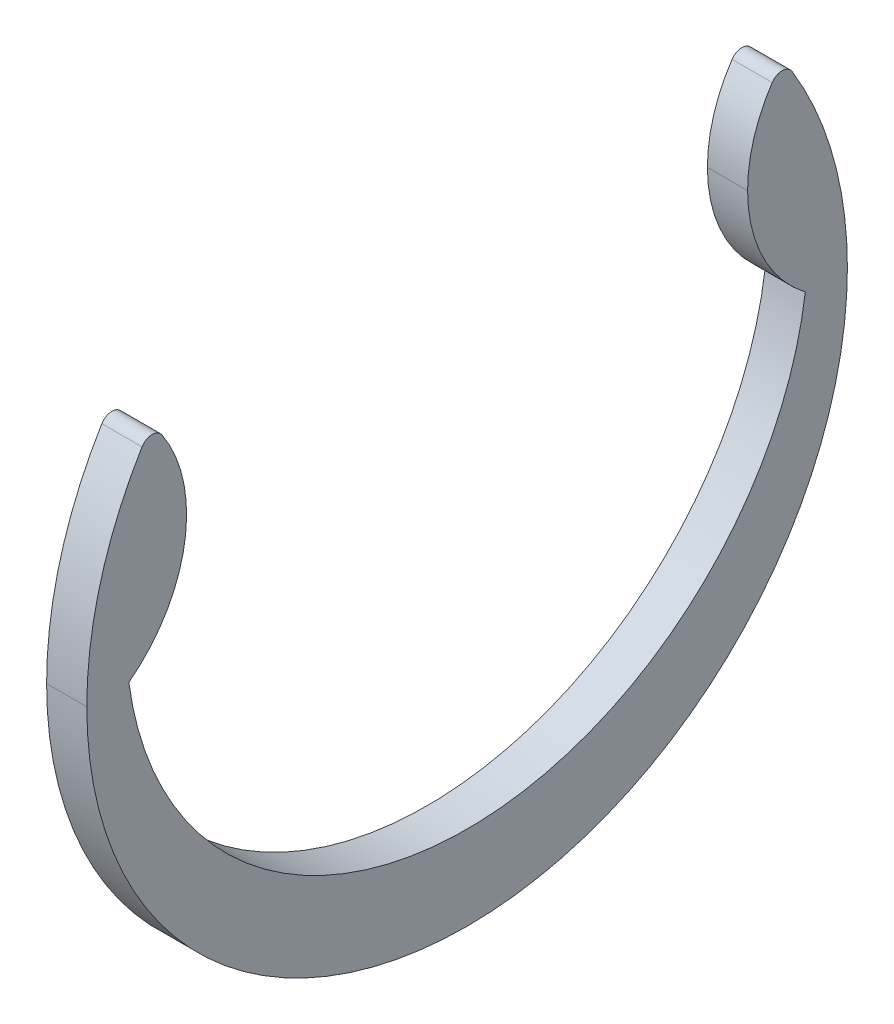
ISO-10303-21;
HEADER;
FILE_DESCRIPTION(('STEP AP214'),'2;1');
FILE_NAME('part.step','',(''),(''),'','','');
FILE_SCHEMA(('AUTOMOTIVE_DESIGN { 1 0 10303 214 1 1 1 1 }'));
ENDSEC;
DATA;
#1=APPLICATION_CONTEXT('core data for automotive mechanical design processes');
#2=APPLICATION_PROTOCOL_DEFINITION('international standard','automotive_design',2000,#1);
#3=PRODUCT_CONTEXT('',#1,'mechanical');
#4=PRODUCT('Part','Part','',(#3));
#5=PRODUCT_RELATED_PRODUCT_CATEGORY('part','',(#4));
#6=PRODUCT_DEFINITION_FORMATION('','',#4);
#7=PRODUCT_DEFINITION_CONTEXT('part definition',#1,'design');
#8=PRODUCT_DEFINITION('design','',#6,#7);
#9=PRODUCT_DEFINITION_SHAPE('','',#8);
#10=(LENGTH_UNIT() NAMED_UNIT(*) SI_UNIT(.MILLI.,.METRE.));
#11=(NAMED_UNIT(*) PLANE_ANGLE_UNIT() SI_UNIT($,.RADIAN.));
#12=(NAMED_UNIT(*) SI_UNIT($,.STERADIAN.) SOLID_ANGLE_UNIT());
#13=UNCERTAINTY_MEASURE_WITH_UNIT(LENGTH_MEASURE(1.E-05),#10,'distance_accuracy_value','');
#14=(GEOMETRIC_REPRESENTATION_CONTEXT(3) GLOBAL_UNCERTAINTY_ASSIGNED_CONTEXT((#13)) GLOBAL_UNIT_ASSIGNED_CONTEXT((#10,
#11,#12)) REPRESENTATION_CONTEXT('',''));
#15=CARTESIAN_POINT('',(0.,0.,0.));
#16=DIRECTION('',(0.,0.,1.));
#17=DIRECTION('',(1.,0.,0.));
#18=AXIS2_PLACEMENT_3D('',#15,#16,#17);
#19=CARTESIAN_POINT('',(-0.533399999999989,2.14558900946491,5.66841071299605));
#20=DIRECTION('',(-1.,0.,0.));
#21=DIRECTION('',(0.,0.,1.));
#22=AXIS2_PLACEMENT_3D('',#19,#20,#21);
#23=PLANE('',#22);
#24=CARTESIAN_POINT('',(-0.533399999999989,3.09413633880058,11.3368214259921));
#25=DIRECTION('',(1.,0.,0.));
#26=DIRECTION('',(0.,0.,1.));
#27=AXIS2_PLACEMENT_3D('',#24,#25,#26);
#28=CIRCLE('',#27,3.89017649139968);
#29=CARTESIAN_POINT('',(-0.533399999999989,0.,8.9789));
#30=VERTEX_POINT('',#29);
#31=CARTESIAN_POINT('',(-0.533399999999989,5.25205704639286,8.10002496127841));
#32=VERTEX_POINT('',#31);
#33=EDGE_CURVE('E154',#30,#32,#28,.T.);
#34=ORIENTED_EDGE('',*,*,#33,.F.);
#35=CARTESIAN_POINT('',(-0.5334,1.19704168012925,0.));
#36=DIRECTION('',(-1.,0.,0.));
#37=DIRECTION('',(0.,0.,-1.));
#38=AXIS2_PLACEMENT_3D('',#35,#36,#37);
#39=CIRCLE('',#38,9.05834168012927);
#40=CARTESIAN_POINT('',(-0.5334,0.,-8.9789));
#41=VERTEX_POINT('',#40);
#42=EDGE_CURVE('E27',#41,#30,#39,.T.);
#43=ORIENTED_EDGE('',*,*,#42,.F.);
#44=CARTESIAN_POINT('',(-0.5334,3.09413633880057,-11.3368214259921));
#45=DIRECTION('',(1.,0.,0.));
#46=DIRECTION('',(0.,0.,1.));
#47=AXIS2_PLACEMENT_3D('',#44,#45,#46);
#48=CIRCLE('',#47,3.89017649139968);
#49=CARTESIAN_POINT('',(-0.5334,3.09413633880057,-7.44664493459242));
#50=VERTEX_POINT('',#49);
#51=EDGE_CURVE('E151',#50,#41,#48,.T.);
#52=ORIENTED_EDGE('',*,*,#51,.F.);
#53=CARTESIAN_POINT('',(-0.5334,3.09413633880057,-11.3368214259921));
#54=DIRECTION('',(1.,0.,0.));
#55=DIRECTION('',(0.,0.,1.));
#56=AXIS2_PLACEMENT_3D('',#53,#54,#55);
#57=CIRCLE('',#56,3.89017649139968);
#58=CARTESIAN_POINT('',(-0.5334,5.25205704639285,-8.10002496127839));
#59=VERTEX_POINT('',#58);
#60=EDGE_CURVE('E99',#59,#50,#57,.T.);
#61=ORIENTED_EDGE('',*,*,#60,.F.);
#62=CARTESIAN_POINT('',(-0.5334,5.07785121071208,-8.36132688543166));
#63=DIRECTION('',(1.,0.,0.));
#64=DIRECTION('',(0.,0.,-1.));
#65=AXIS2_PLACEMENT_3D('',#62,#63,#64);
#66=CIRCLE('',#65,0.314048354161319);
#67=CARTESIAN_POINT('',(-0.5334,5.24086666666668,-8.62975253597822));
#68=VERTEX_POINT('',#67);
#69=EDGE_CURVE('E165',#68,#59,#66,.T.);
#70=ORIENTED_EDGE('',*,*,#69,.F.);
#71=CARTESIAN_POINT('',(-0.5334,0.,0.));
#72=DIRECTION('',(1.,0.,0.));
#73=DIRECTION('',(0.,0.,1.));
#74=AXIS2_PLACEMENT_3D('',#71,#72,#73);
#75=CIRCLE('',#74,10.0965);
#76=CARTESIAN_POINT('',(-0.5334,0.,-10.0965));
#77=VERTEX_POINT('',#76);
#78=EDGE_CURVE('E133',#77,#68,#75,.T.);
#79=ORIENTED_EDGE('',*,*,#78,.F.);
#80=CARTESIAN_POINT('',(-0.5334,0.,0.));
#81=DIRECTION('',(1.,0.,0.));
#82=DIRECTION('',(0.,0.,1.));
#83=AXIS2_PLACEMENT_3D('',#80,#81,#82);
#84=CIRCLE('',#83,10.0965);
#85=CARTESIAN_POINT('',(-0.5334,0.,10.0965));
#86=VERTEX_POINT('',#85);
#87=EDGE_CURVE('E20',#86,#77,#84,.T.);
#88=ORIENTED_EDGE('',*,*,#87,.F.);
#89=CARTESIAN_POINT('',(-0.5334,0.,0.));
#90=DIRECTION('',(1.,0.,0.));
#91=DIRECTION('',(0.,0.,1.));
#92=AXIS2_PLACEMENT_3D('',#89,#90,#91);
#93=CIRCLE('',#92,10.0965);
#94=CARTESIAN_POINT('',(-0.533399999999989,5.24086666666668,8.62975253597823));
#95=VERTEX_POINT('',#94);
#96=EDGE_CURVE('E168',#95,#86,#93,.T.);
#97=ORIENTED_EDGE('',*,*,#96,.F.);
#98=CARTESIAN_POINT('',(-0.533399999999989,5.07785121071208,8.36132688543166));
#99=DIRECTION('',(1.,0.,0.));
#100=DIRECTION('',(0.,0.,1.));
#101=AXIS2_PLACEMENT_3D('',#98,#99,#100);
#102=CIRCLE('',#101,0.314048354161319);
#103=EDGE_CURVE('E186',#32,#95,#102,.T.);
#104=ORIENTED_EDGE('',*,*,#103,.F.);
#105=EDGE_LOOP('',(#34,#43,#52,#61,#70,#79,#88,#97,#104));
#106=FACE_BOUND('',#105,.T.);
#107=ADVANCED_FACE('F16',(#106),#23,.T.);
#108=CARTESIAN_POINT('',(0.5334,2.14558900946491,5.66841071299605));
#109=DIRECTION('',(-1.,0.,0.));
#110=DIRECTION('',(0.,0.,1.));
#111=AXIS2_PLACEMENT_3D('',#108,#109,#110);
#112=PLANE('',#111);
#113=CARTESIAN_POINT('',(0.5334,3.09413633880058,11.3368214259921));
#114=DIRECTION('',(1.,0.,0.));
#115=DIRECTION('',(0.,0.,1.));
#116=AXIS2_PLACEMENT_3D('',#113,#114,#115);
#117=CIRCLE('',#116,3.89017649139968);
#118=CARTESIAN_POINT('',(0.5334,0.,8.9789));
#119=VERTEX_POINT('',#118);
#120=CARTESIAN_POINT('',(0.5334,5.25205704639286,8.10002496127841));
#121=VERTEX_POINT('',#120);
#122=EDGE_CURVE('E187',#119,#121,#117,.T.);
#123=ORIENTED_EDGE('',*,*,#122,.T.);
#124=CARTESIAN_POINT('',(0.5334,5.07785121071208,8.36132688543166));
#125=DIRECTION('',(1.,0.,0.));
#126=DIRECTION('',(0.,0.,1.));
#127=AXIS2_PLACEMENT_3D('',#124,#125,#126);
#128=CIRCLE('',#127,0.314048354161319);
#129=CARTESIAN_POINT('',(0.5334,5.24086666666668,8.62975253597823));
#130=VERTEX_POINT('',#129);
#131=EDGE_CURVE('E174',#121,#130,#128,.T.);
#132=ORIENTED_EDGE('',*,*,#131,.T.);
#133=CARTESIAN_POINT('',(0.5334,0.,0.));
#134=DIRECTION('',(1.,0.,0.));
#135=DIRECTION('',(0.,0.,1.));
#136=AXIS2_PLACEMENT_3D('',#133,#134,#135);
#137=CIRCLE('',#136,10.0965);
#138=CARTESIAN_POINT('',(0.5334,0.,10.0965));
#139=VERTEX_POINT('',#138);
#140=EDGE_CURVE('E171',#130,#139,#137,.T.);
#141=ORIENTED_EDGE('',*,*,#140,.T.);
#142=CARTESIAN_POINT('',(0.5334,0.,0.));
#143=DIRECTION('',(1.,0.,0.));
#144=DIRECTION('',(0.,0.,1.));
#145=AXIS2_PLACEMENT_3D('',#142,#143,#144);
#146=CIRCLE('',#145,10.0965);
#147=CARTESIAN_POINT('',(0.5334,0.,-10.0965));
#148=VERTEX_POINT('',#147);
#149=EDGE_CURVE('E135',#139,#148,#146,.T.);
#150=ORIENTED_EDGE('',*,*,#149,.T.);
#151=CARTESIAN_POINT('',(0.5334,0.,0.));
#152=DIRECTION('',(1.,0.,0.));
#153=DIRECTION('',(0.,0.,1.));
#154=AXIS2_PLACEMENT_3D('',#151,#152,#153);
#155=CIRCLE('',#154,10.0965);
#156=CARTESIAN_POINT('',(0.5334,5.24086666666668,-8.62975253597822));
#157=VERTEX_POINT('',#156);
#158=EDGE_CURVE('E131',#148,#157,#155,.T.);
#159=ORIENTED_EDGE('',*,*,#158,.T.);
#160=CARTESIAN_POINT('',(0.5334,5.07785121071208,-8.36132688543166));
#161=DIRECTION('',(1.,0.,0.));
#162=DIRECTION('',(0.,0.,-1.));
#163=AXIS2_PLACEMENT_3D('',#160,#161,#162);
#164=CIRCLE('',#163,0.314048354161319);
#165=CARTESIAN_POINT('',(0.5334,5.25205704639285,-8.10002496127839));
#166=VERTEX_POINT('',#165);
#167=EDGE_CURVE('E116',#157,#166,#164,.T.);
#168=ORIENTED_EDGE('',*,*,#167,.T.);
#169=CARTESIAN_POINT('',(0.5334,3.09413633880057,-11.3368214259921));
#170=DIRECTION('',(1.,0.,0.));
#171=DIRECTION('',(0.,0.,1.));
#172=AXIS2_PLACEMENT_3D('',#169,#170,#171);
#173=CIRCLE('',#172,3.89017649139968);
#174=CARTESIAN_POINT('',(0.5334,3.09413633880057,-7.44664493459242));
#175=VERTEX_POINT('',#174);
#176=EDGE_CURVE('E42',#166,#175,#173,.T.);
#177=ORIENTED_EDGE('',*,*,#176,.T.);
#178=CARTESIAN_POINT('',(0.5334,3.09413633880057,-11.3368214259921));
#179=DIRECTION('',(1.,0.,0.));
#180=DIRECTION('',(0.,0.,1.));
#181=AXIS2_PLACEMENT_3D('',#178,#179,#180);
#182=CIRCLE('',#181,3.89017649139968);
#183=CARTESIAN_POINT('',(0.5334,0.,-8.9789));
#184=VERTEX_POINT('',#183);
#185=EDGE_CURVE('E175',#175,#184,#182,.T.);
#186=ORIENTED_EDGE('',*,*,#185,.T.);
#187=CARTESIAN_POINT('',(0.5334,1.19704168012925,0.));
#188=DIRECTION('',(-1.,0.,0.));
#189=DIRECTION('',(0.,0.,-1.));
#190=AXIS2_PLACEMENT_3D('',#187,#188,#189);
#191=CIRCLE('',#190,9.05834168012927);
#192=EDGE_CURVE('E11',#184,#119,#191,.T.);
#193=ORIENTED_EDGE('',*,*,#192,.T.);
#194=EDGE_LOOP('',(#123,#132,#141,#150,#159,#168,#177,#186,#193));
#195=FACE_BOUND('',#194,.T.);
#196=ADVANCED_FACE('F138',(#195),#112,.F.);
#197=CARTESIAN_POINT('',(0.5334,1.19704168012925,0.));
#198=DIRECTION('',(-1.,0.,0.));
#199=DIRECTION('',(0.,0.,1.));
#200=AXIS2_PLACEMENT_3D('',#197,#198,#199);
#201=CYLINDRICAL_SURFACE('',#200,9.05834168012927);
#202=ORIENTED_EDGE('',*,*,#42,.T.);
#203=DIRECTION('',(-1.,0.,0.));
#204=VECTOR('',#203,1.);
#205=CARTESIAN_POINT('',(0.5334,0.,8.9789));
#206=LINE('',#205,#204);
#207=EDGE_CURVE('E182',#119,#30,#206,.T.);
#208=ORIENTED_EDGE('',*,*,#207,.F.);
#209=ORIENTED_EDGE('',*,*,#192,.F.);
#210=DIRECTION('',(-1.,0.,0.));
#211=VECTOR('',#210,1.);
#212=CARTESIAN_POINT('',(0.5334,0.,-8.9789));
#213=LINE('',#212,#211);
#214=EDGE_CURVE('E144',#184,#41,#213,.T.);
#215=ORIENTED_EDGE('',*,*,#214,.T.);
#216=EDGE_LOOP('',(#202,#208,#209,#215));
#217=FACE_BOUND('',#216,.T.);
#218=ADVANCED_FACE('F264',(#217),#201,.F.);
#219=CARTESIAN_POINT('',(0.5334,3.09413633880057,-11.3368214259921));
#220=DIRECTION('',(-1.,0.,0.));
#221=DIRECTION('',(0.,0.,1.));
#222=AXIS2_PLACEMENT_3D('',#219,#220,#221);
#223=CYLINDRICAL_SURFACE('',#222,3.89017649139968);
#224=DIRECTION('',(-1.,0.,0.));
#225=VECTOR('',#224,1.);
#226=CARTESIAN_POINT('',(0.5334,3.09413633880057,-7.44664493459241));
#227=LINE('',#226,#225);
#228=EDGE_CURVE('E179',#175,#50,#227,.T.);
#229=ORIENTED_EDGE('',*,*,#228,.F.);
#230=ORIENTED_EDGE('',*,*,#176,.F.);
#231=DIRECTION('',(-1.,0.,0.));
#232=VECTOR('',#231,1.);
#233=CARTESIAN_POINT('',(0.5334,5.25205704639285,-8.10002496127839));
#234=LINE('',#233,#232);
#235=EDGE_CURVE('E122',#166,#59,#234,.T.);
#236=ORIENTED_EDGE('',*,*,#235,.T.);
#237=ORIENTED_EDGE('',*,*,#60,.T.);
#238=EDGE_LOOP('',(#229,#230,#236,#237));
#239=FACE_BOUND('',#238,.T.);
#240=ADVANCED_FACE('F259',(#239),#223,.T.);
#241=CARTESIAN_POINT('',(0.5334,5.07785121071208,-8.36132688543166));
#242=DIRECTION('',(-1.,0.,0.));
#243=DIRECTION('',(0.,0.,1.));
#244=AXIS2_PLACEMENT_3D('',#241,#242,#243);
#245=CYLINDRICAL_SURFACE('',#244,0.314048354161319);
#246=ORIENTED_EDGE('',*,*,#69,.T.);
#247=ORIENTED_EDGE('',*,*,#235,.F.);
#248=ORIENTED_EDGE('',*,*,#167,.F.);
#249=DIRECTION('',(-1.,0.,0.));
#250=VECTOR('',#249,1.);
#251=CARTESIAN_POINT('',(0.5334,5.24086666666668,-8.62975253597822));
#252=LINE('',#251,#250);
#253=EDGE_CURVE('E120',#157,#68,#252,.T.);
#254=ORIENTED_EDGE('',*,*,#253,.T.);
#255=EDGE_LOOP('',(#246,#247,#248,#254));
#256=FACE_BOUND('',#255,.T.);
#257=ADVANCED_FACE('F119',(#256),#245,.T.);
#258=CARTESIAN_POINT('',(0.5334,0.,0.));
#259=DIRECTION('',(-1.,0.,0.));
#260=DIRECTION('',(0.,0.,1.));
#261=AXIS2_PLACEMENT_3D('',#258,#259,#260);
#262=CYLINDRICAL_SURFACE('',#261,10.0965);
#263=DIRECTION('',(-1.,0.,0.));
#264=VECTOR('',#263,1.);
#265=CARTESIAN_POINT('',(0.5334,0.,10.0965));
#266=LINE('',#265,#264);
#267=EDGE_CURVE('E159',#139,#86,#266,.T.);
#268=ORIENTED_EDGE('',*,*,#267,.F.);
#269=ORIENTED_EDGE('',*,*,#140,.F.);
#270=DIRECTION('',(-1.,0.,0.));
#271=VECTOR('',#270,1.);
#272=CARTESIAN_POINT('',(0.5334,5.24086666666668,8.62975253597823));
#273=LINE('',#272,#271);
#274=EDGE_CURVE('E194',#130,#95,#273,.T.);
#275=ORIENTED_EDGE('',*,*,#274,.T.);
#276=ORIENTED_EDGE('',*,*,#96,.T.);
#277=EDGE_LOOP('',(#268,#269,#275,#276));
#278=FACE_BOUND('',#277,.T.);
#279=ADVANCED_FACE('F249',(#278),#262,.T.);
#280=CARTESIAN_POINT('',(0.5334,5.07785121071208,8.36132688543166));
#281=DIRECTION('',(-1.,0.,0.));
#282=DIRECTION('',(0.,0.,1.));
#283=AXIS2_PLACEMENT_3D('',#280,#281,#282);
#284=CYLINDRICAL_SURFACE('',#283,0.314048354161319);
#285=ORIENTED_EDGE('',*,*,#103,.T.);
#286=ORIENTED_EDGE('',*,*,#274,.F.);
#287=ORIENTED_EDGE('',*,*,#131,.F.);
#288=DIRECTION('',(-1.,0.,0.));
#289=VECTOR('',#288,1.);
#290=CARTESIAN_POINT('',(0.5334,5.25205704639286,8.10002496127841));
#291=LINE('',#290,#289);
#292=EDGE_CURVE('E158',#121,#32,#291,.T.);
#293=ORIENTED_EDGE('',*,*,#292,.T.);
#294=EDGE_LOOP('',(#285,#286,#287,#293));
#295=FACE_BOUND('',#294,.T.);
#296=ADVANCED_FACE('F243',(#295),#284,.T.);
#297=CARTESIAN_POINT('',(0.5334,3.09413633880058,11.3368214259921));
#298=DIRECTION('',(-1.,0.,0.));
#299=DIRECTION('',(0.,0.,1.));
#300=AXIS2_PLACEMENT_3D('',#297,#298,#299);
#301=CYLINDRICAL_SURFACE('',#300,3.89017649139968);
#302=ORIENTED_EDGE('',*,*,#33,.T.);
#303=ORIENTED_EDGE('',*,*,#292,.F.);
#304=ORIENTED_EDGE('',*,*,#122,.F.);
#305=ORIENTED_EDGE('',*,*,#207,.T.);
#306=EDGE_LOOP('',(#302,#303,#304,#305));
#307=FACE_BOUND('',#306,.T.);
#308=ADVANCED_FACE('F248',(#307),#301,.T.);
#309=CARTESIAN_POINT('',(0.5334,0.,0.));
#310=DIRECTION('',(-1.,0.,0.));
#311=DIRECTION('',(0.,0.,1.));
#312=AXIS2_PLACEMENT_3D('',#309,#310,#311);
#313=CYLINDRICAL_SURFACE('',#312,10.0965);
#314=DIRECTION('',(-1.,0.,0.));
#315=VECTOR('',#314,1.);
#316=CARTESIAN_POINT('',(0.5334,0.,-10.0965));
#317=LINE('',#316,#315);
#318=EDGE_CURVE('E143',#148,#77,#317,.T.);
#319=ORIENTED_EDGE('',*,*,#318,.F.);
#320=ORIENTED_EDGE('',*,*,#149,.F.);
#321=ORIENTED_EDGE('',*,*,#267,.T.);
#322=ORIENTED_EDGE('',*,*,#87,.T.);
#323=EDGE_LOOP('',(#319,#320,#321,#322));
#324=FACE_BOUND('',#323,.T.);
#325=ADVANCED_FACE('F18',(#324),#313,.T.);
#326=CARTESIAN_POINT('',(0.5334,0.,0.));
#327=DIRECTION('',(-1.,0.,0.));
#328=DIRECTION('',(0.,0.,1.));
#329=AXIS2_PLACEMENT_3D('',#326,#327,#328);
#330=CYLINDRICAL_SURFACE('',#329,10.0965);
#331=ORIENTED_EDGE('',*,*,#158,.F.);
#332=ORIENTED_EDGE('',*,*,#318,.T.);
#333=ORIENTED_EDGE('',*,*,#78,.T.);
#334=ORIENTED_EDGE('',*,*,#253,.F.);
#335=EDGE_LOOP('',(#331,#332,#333,#334));
#336=FACE_BOUND('',#335,.T.);
#337=ADVANCED_FACE('F129',(#336),#330,.T.);
#338=CARTESIAN_POINT('',(0.5334,3.09413633880057,-11.3368214259921));
#339=DIRECTION('',(-1.,0.,0.));
#340=DIRECTION('',(0.,0.,1.));
#341=AXIS2_PLACEMENT_3D('',#338,#339,#340);
#342=CYLINDRICAL_SURFACE('',#341,3.89017649139968);
#343=ORIENTED_EDGE('',*,*,#185,.F.);
#344=ORIENTED_EDGE('',*,*,#228,.T.);
#345=ORIENTED_EDGE('',*,*,#51,.T.);
#346=ORIENTED_EDGE('',*,*,#214,.F.);
#347=EDGE_LOOP('',(#343,#344,#345,#346));
#348=FACE_BOUND('',#347,.T.);
#349=ADVANCED_FACE('F229',(#348),#342,.T.);
#350=CLOSED_SHELL('',(#107,#196,#218,#240,#257,#279,#296,#308,#325,#337,#349));
#351=MANIFOLD_SOLID_BREP('B1',#350);
#352=ADVANCED_BREP_SHAPE_REPRESENTATION('',(#18,#351),#14);
#353=SHAPE_DEFINITION_REPRESENTATION(#9,#352);
ENDSEC;
END-ISO-10303-21;
